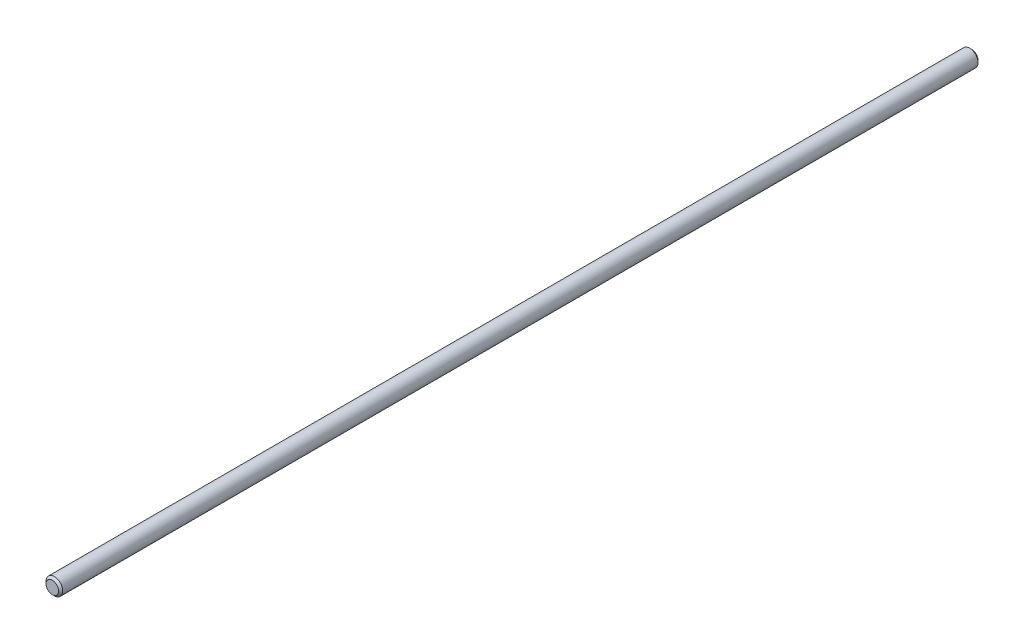
ISO-10303-21;
HEADER;
FILE_DESCRIPTION(('STEP AP214'),'2;1');
FILE_NAME('part.step','',(''),(''),'','','');
FILE_SCHEMA(('AUTOMOTIVE_DESIGN { 1 0 10303 214 1 1 1 1 }'));
ENDSEC;
DATA;
#1=APPLICATION_CONTEXT('core data for automotive mechanical design processes');
#2=APPLICATION_PROTOCOL_DEFINITION('international standard','automotive_design',2000,#1);
#3=PRODUCT_CONTEXT('',#1,'mechanical');
#4=PRODUCT('Part','Part','',(#3));
#5=PRODUCT_RELATED_PRODUCT_CATEGORY('part','',(#4));
#6=PRODUCT_DEFINITION_FORMATION('','',#4);
#7=PRODUCT_DEFINITION_CONTEXT('part definition',#1,'design');
#8=PRODUCT_DEFINITION('design','',#6,#7);
#9=PRODUCT_DEFINITION_SHAPE('','',#8);
#10=(LENGTH_UNIT() NAMED_UNIT(*) SI_UNIT(.MILLI.,.METRE.));
#11=(NAMED_UNIT(*) PLANE_ANGLE_UNIT() SI_UNIT($,.RADIAN.));
#12=(NAMED_UNIT(*) SI_UNIT($,.STERADIAN.) SOLID_ANGLE_UNIT());
#13=UNCERTAINTY_MEASURE_WITH_UNIT(LENGTH_MEASURE(1.E-05),#10,'distance_accuracy_value','');
#14=(GEOMETRIC_REPRESENTATION_CONTEXT(3) GLOBAL_UNCERTAINTY_ASSIGNED_CONTEXT((#13)) GLOBAL_UNIT_ASSIGNED_CONTEXT((#10,
#11,#12)) REPRESENTATION_CONTEXT('',''));
#15=CARTESIAN_POINT('',(0.,0.,0.));
#16=DIRECTION('',(0.,0.,1.));
#17=DIRECTION('',(1.,0.,0.));
#18=AXIS2_PLACEMENT_3D('',#15,#16,#17);
#19=CARTESIAN_POINT('',(0.,0.,440.));
#20=DIRECTION('',(0.,0.,-1.));
#21=DIRECTION('',(-1.,0.,0.));
#22=AXIS2_PLACEMENT_3D('',#19,#20,#21);
#23=CYLINDRICAL_SURFACE('',#22,4.);
#24=CARTESIAN_POINT('',(0.,0.,439.));
#25=DIRECTION('',(0.,0.,1.));
#26=DIRECTION('',(1.,0.,0.));
#27=AXIS2_PLACEMENT_3D('',#24,#25,#26);
#28=CIRCLE('',#27,4.);
#29=CARTESIAN_POINT('',(3.99999999999998,0.,439.));
#30=VERTEX_POINT('',#29);
#31=EDGE_CURVE('E55',#30,#30,#28,.F.);
#32=ORIENTED_EDGE('',*,*,#31,.T.);
#33=EDGE_LOOP('',(#32));
#34=FACE_BOUND('',#33,.T.);
#35=CARTESIAN_POINT('',(0.,0.,0.99999999999989));
#36=DIRECTION('',(0.,0.,1.));
#37=DIRECTION('',(1.,0.,0.));
#38=AXIS2_PLACEMENT_3D('',#35,#36,#37);
#39=CIRCLE('',#38,4.);
#40=CARTESIAN_POINT('',(4.,0.,0.99999999999989));
#41=VERTEX_POINT('',#40);
#42=EDGE_CURVE('E59',#41,#41,#39,.T.);
#43=ORIENTED_EDGE('',*,*,#42,.T.);
#44=EDGE_LOOP('',(#43));
#45=FACE_BOUND('',#44,.T.);
#46=ADVANCED_FACE('F48',(#34,#45),#23,.T.);
#47=CARTESIAN_POINT('',(0.,0.,440.));
#48=DIRECTION('',(0.,0.,1.));
#49=DIRECTION('',(1.,0.,0.));
#50=AXIS2_PLACEMENT_3D('',#47,#48,#49);
#51=PLANE('',#50);
#52=CARTESIAN_POINT('',(0.,0.,440.));
#53=DIRECTION('',(0.,0.,1.));
#54=DIRECTION('',(1.,0.,0.));
#55=AXIS2_PLACEMENT_3D('',#52,#53,#54);
#56=CIRCLE('',#55,3.00000000000006);
#57=CARTESIAN_POINT('',(3.00000000000006,0.,440.));
#58=VERTEX_POINT('',#57);
#59=EDGE_CURVE('E63',#58,#58,#56,.T.);
#60=ORIENTED_EDGE('',*,*,#59,.T.);
#61=EDGE_LOOP('',(#60));
#62=FACE_BOUND('',#61,.T.);
#63=ADVANCED_FACE('F69',(#62),#51,.T.);
#64=CARTESIAN_POINT('',(0.,0.,0.));
#65=DIRECTION('',(0.,0.,1.));
#66=DIRECTION('',(1.,0.,0.));
#67=AXIS2_PLACEMENT_3D('',#64,#65,#66);
#68=PLANE('',#67);
#69=CARTESIAN_POINT('',(0.,0.,0.));
#70=DIRECTION('',(0.,0.,1.));
#71=DIRECTION('',(1.,0.,0.));
#72=AXIS2_PLACEMENT_3D('',#69,#70,#71);
#73=CIRCLE('',#72,3.00000000000011);
#74=CARTESIAN_POINT('',(3.00000000000012,0.,0.));
#75=VERTEX_POINT('',#74);
#76=EDGE_CURVE('E12',#75,#75,#73,.F.);
#77=ORIENTED_EDGE('',*,*,#76,.T.);
#78=EDGE_LOOP('',(#77));
#79=FACE_BOUND('',#78,.T.);
#80=ADVANCED_FACE('F73',(#79),#68,.F.);
#81=CARTESIAN_POINT('',(0.,0.,440.));
#82=DIRECTION('',(0.,0.,-1.));
#83=DIRECTION('',(-1.,0.,0.));
#84=AXIS2_PLACEMENT_3D('',#81,#82,#83);
#85=CONICAL_SURFACE('',#84,3.00000000000006,0.785398163397419);
#86=ORIENTED_EDGE('',*,*,#31,.F.);
#87=EDGE_LOOP('',(#86));
#88=FACE_BOUND('',#87,.T.);
#89=ORIENTED_EDGE('',*,*,#59,.F.);
#90=EDGE_LOOP('',(#89));
#91=FACE_BOUND('',#90,.T.);
#92=ADVANCED_FACE('F71',(#88,#91),#85,.T.);
#93=CARTESIAN_POINT('',(0.,0.,0.99999999999989));
#94=DIRECTION('',(0.,0.,1.));
#95=DIRECTION('',(1.,0.,0.));
#96=AXIS2_PLACEMENT_3D('',#93,#94,#95);
#97=CONICAL_SURFACE('',#96,4.,0.785398163397447);
#98=ORIENTED_EDGE('',*,*,#76,.F.);
#99=EDGE_LOOP('',(#98));
#100=FACE_BOUND('',#99,.T.);
#101=ORIENTED_EDGE('',*,*,#42,.F.);
#102=EDGE_LOOP('',(#101));
#103=FACE_BOUND('',#102,.T.);
#104=ADVANCED_FACE('F50',(#100,#103),#97,.T.);
#105=CLOSED_SHELL('',(#46,#63,#80,#92,#104));
#106=MANIFOLD_SOLID_BREP('B2',#105);
#107=ADVANCED_BREP_SHAPE_REPRESENTATION('',(#18,#106),#14);
#108=SHAPE_DEFINITION_REPRESENTATION(#9,#107);
ENDSEC;
END-ISO-10303-21;
